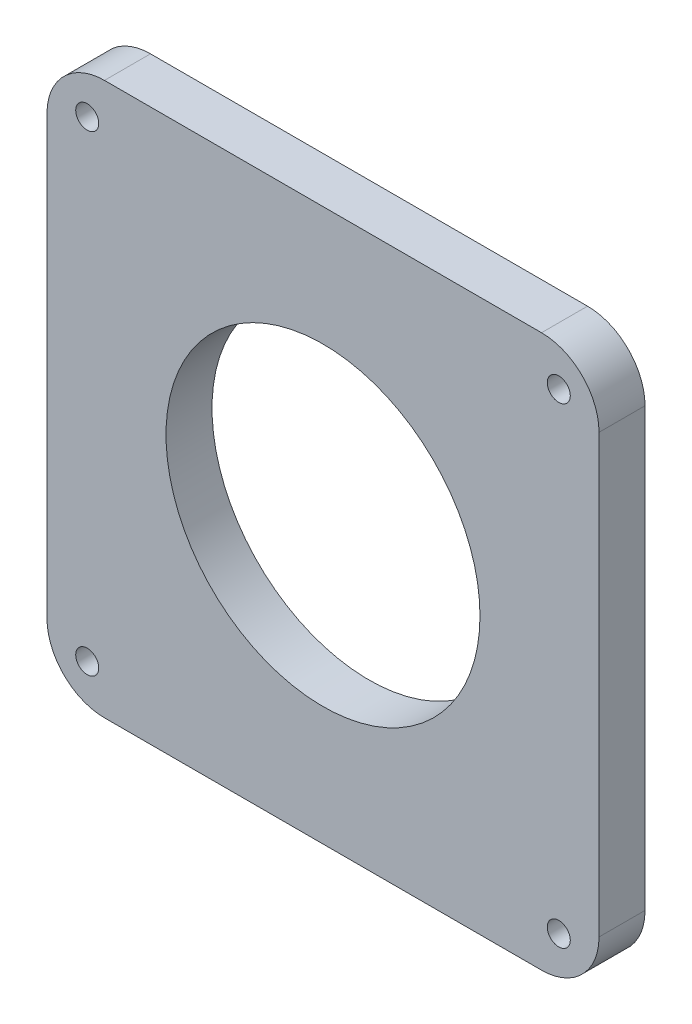
ISO-10303-21;
HEADER;
FILE_DESCRIPTION(('STEP AP214'),'2;1');
FILE_NAME('part.step','',(''),(''),'','','');
FILE_SCHEMA(('AUTOMOTIVE_DESIGN { 1 0 10303 214 1 1 1 1 }'));
ENDSEC;
DATA;
#1=APPLICATION_CONTEXT('core data for automotive mechanical design processes');
#2=APPLICATION_PROTOCOL_DEFINITION('international standard','automotive_design',2000,#1);
#3=PRODUCT_CONTEXT('',#1,'mechanical');
#4=PRODUCT('Part','Part','',(#3));
#5=PRODUCT_RELATED_PRODUCT_CATEGORY('part','',(#4));
#6=PRODUCT_DEFINITION_FORMATION('','',#4);
#7=PRODUCT_DEFINITION_CONTEXT('part definition',#1,'design');
#8=PRODUCT_DEFINITION('design','',#6,#7);
#9=PRODUCT_DEFINITION_SHAPE('','',#8);
#10=(LENGTH_UNIT() NAMED_UNIT(*) SI_UNIT(.MILLI.,.METRE.));
#11=(NAMED_UNIT(*) PLANE_ANGLE_UNIT() SI_UNIT($,.RADIAN.));
#12=(NAMED_UNIT(*) SI_UNIT($,.STERADIAN.) SOLID_ANGLE_UNIT());
#13=UNCERTAINTY_MEASURE_WITH_UNIT(LENGTH_MEASURE(1.E-05),#10,'distance_accuracy_value','');
#14=(GEOMETRIC_REPRESENTATION_CONTEXT(3) GLOBAL_UNCERTAINTY_ASSIGNED_CONTEXT((#13)) GLOBAL_UNIT_ASSIGNED_CONTEXT((#10,
#11,#12)) REPRESENTATION_CONTEXT('',''));
#15=CARTESIAN_POINT('',(0.,0.,0.));
#16=DIRECTION('',(0.,0.,1.));
#17=DIRECTION('',(1.,0.,0.));
#18=AXIS2_PLACEMENT_3D('',#15,#16,#17);
#19=CARTESIAN_POINT('',(10.,86.,8.));
#20=DIRECTION('',(0.,0.,1.));
#21=DIRECTION('',(1.,0.,0.));
#22=AXIS2_PLACEMENT_3D('',#19,#20,#21);
#23=PLANE('',#22);
#24=CARTESIAN_POINT('',(6.99999999999999,7.00000000000001,8.));
#25=DIRECTION('',(0.,0.,-1.));
#26=DIRECTION('',(-1.,0.,0.));
#27=AXIS2_PLACEMENT_3D('',#24,#25,#26);
#28=CIRCLE('',#27,2.);
#29=CARTESIAN_POINT('',(4.99999999999999,7.00000000000001,8.));
#30=VERTEX_POINT('',#29);
#31=EDGE_CURVE('E459',#30,#30,#28,.T.);
#32=ORIENTED_EDGE('',*,*,#31,.T.);
#33=EDGE_LOOP('',(#32));
#34=FACE_BOUND('',#33,.T.);
#35=CARTESIAN_POINT('',(89.,7.00000000000001,8.));
#36=DIRECTION('',(0.,0.,-1.));
#37=DIRECTION('',(-1.,0.,0.));
#38=AXIS2_PLACEMENT_3D('',#35,#36,#37);
#39=CIRCLE('',#38,2.);
#40=CARTESIAN_POINT('',(87.,7.00000000000001,8.));
#41=VERTEX_POINT('',#40);
#42=EDGE_CURVE('E455',#41,#41,#39,.T.);
#43=ORIENTED_EDGE('',*,*,#42,.T.);
#44=EDGE_LOOP('',(#43));
#45=FACE_BOUND('',#44,.T.);
#46=CARTESIAN_POINT('',(89.,89.,8.));
#47=DIRECTION('',(0.,0.,-1.));
#48=DIRECTION('',(-1.,0.,0.));
#49=AXIS2_PLACEMENT_3D('',#46,#47,#48);
#50=CIRCLE('',#49,2.);
#51=CARTESIAN_POINT('',(87.,89.,8.));
#52=VERTEX_POINT('',#51);
#53=EDGE_CURVE('E453',#52,#52,#50,.T.);
#54=ORIENTED_EDGE('',*,*,#53,.T.);
#55=EDGE_LOOP('',(#54));
#56=FACE_BOUND('',#55,.T.);
#57=CARTESIAN_POINT('',(6.99999999999999,89.,8.));
#58=DIRECTION('',(0.,0.,-1.));
#59=DIRECTION('',(-1.,0.,0.));
#60=AXIS2_PLACEMENT_3D('',#57,#58,#59);
#61=CIRCLE('',#60,2.);
#62=CARTESIAN_POINT('',(4.99999999999999,89.,8.));
#63=VERTEX_POINT('',#62);
#64=EDGE_CURVE('E135',#63,#63,#61,.T.);
#65=ORIENTED_EDGE('',*,*,#64,.T.);
#66=EDGE_LOOP('',(#65));
#67=FACE_BOUND('',#66,.T.);
#68=CARTESIAN_POINT('',(10.,86.,8.));
#69=DIRECTION('',(0.,0.,1.));
#70=DIRECTION('',(1.,0.,0.));
#71=AXIS2_PLACEMENT_3D('',#68,#69,#70);
#72=CIRCLE('',#71,10.);
#73=CARTESIAN_POINT('',(10.0000000000001,96.,8.));
#74=VERTEX_POINT('',#73);
#75=CARTESIAN_POINT('',(0.,85.9999999999999,8.));
#76=VERTEX_POINT('',#75);
#77=EDGE_CURVE('E112',#74,#76,#72,.T.);
#78=ORIENTED_EDGE('',*,*,#77,.T.);
#79=DIRECTION('',(0.,-1.,0.));
#80=VECTOR('',#79,1.);
#81=CARTESIAN_POINT('',(0.,85.9999999999999,8.));
#82=LINE('',#81,#80);
#83=CARTESIAN_POINT('',(0.,10.0000000000001,8.));
#84=VERTEX_POINT('',#83);
#85=EDGE_CURVE('E120',#76,#84,#82,.T.);
#86=ORIENTED_EDGE('',*,*,#85,.T.);
#87=CARTESIAN_POINT('',(10.,10.,8.));
#88=DIRECTION('',(0.,0.,1.));
#89=DIRECTION('',(1.,0.,0.));
#90=AXIS2_PLACEMENT_3D('',#87,#88,#89);
#91=CIRCLE('',#90,10.);
#92=CARTESIAN_POINT('',(10.0000000000001,0.,8.));
#93=VERTEX_POINT('',#92);
#94=EDGE_CURVE('E125',#84,#93,#91,.T.);
#95=ORIENTED_EDGE('',*,*,#94,.T.);
#96=DIRECTION('',(1.,0.,0.));
#97=VECTOR('',#96,1.);
#98=CARTESIAN_POINT('',(10.0000000000001,0.,8.));
#99=LINE('',#98,#97);
#100=CARTESIAN_POINT('',(85.9999999999999,0.,8.));
#101=VERTEX_POINT('',#100);
#102=EDGE_CURVE('E140',#93,#101,#99,.T.);
#103=ORIENTED_EDGE('',*,*,#102,.T.);
#104=CARTESIAN_POINT('',(86.,10.,8.));
#105=DIRECTION('',(0.,0.,1.));
#106=DIRECTION('',(1.,0.,0.));
#107=AXIS2_PLACEMENT_3D('',#104,#105,#106);
#108=CIRCLE('',#107,10.);
#109=CARTESIAN_POINT('',(96.,10.,8.));
#110=VERTEX_POINT('',#109);
#111=EDGE_CURVE('E143',#101,#110,#108,.T.);
#112=ORIENTED_EDGE('',*,*,#111,.T.);
#113=DIRECTION('',(0.,1.,0.));
#114=VECTOR('',#113,1.);
#115=CARTESIAN_POINT('',(96.,10.,8.));
#116=LINE('',#115,#114);
#117=CARTESIAN_POINT('',(96.,85.9999999999999,8.));
#118=VERTEX_POINT('',#117);
#119=EDGE_CURVE('E146',#110,#118,#116,.T.);
#120=ORIENTED_EDGE('',*,*,#119,.T.);
#121=CARTESIAN_POINT('',(86.,86.,8.));
#122=DIRECTION('',(0.,0.,1.));
#123=DIRECTION('',(1.,0.,0.));
#124=AXIS2_PLACEMENT_3D('',#121,#122,#123);
#125=CIRCLE('',#124,9.99999999999999);
#126=CARTESIAN_POINT('',(85.9999999999999,96.,8.));
#127=VERTEX_POINT('',#126);
#128=EDGE_CURVE('E149',#118,#127,#125,.T.);
#129=ORIENTED_EDGE('',*,*,#128,.T.);
#130=DIRECTION('',(-1.,0.,0.));
#131=VECTOR('',#130,1.);
#132=CARTESIAN_POINT('',(85.9999999999999,96.,8.));
#133=LINE('',#132,#131);
#134=EDGE_CURVE('E131',#127,#74,#133,.T.);
#135=ORIENTED_EDGE('',*,*,#134,.T.);
#136=EDGE_LOOP('',(#78,#86,#95,#103,#112,#120,#129,#135));
#137=FACE_BOUND('',#136,.T.);
#138=CARTESIAN_POINT('',(48.,48.,8.));
#139=DIRECTION('',(0.,0.,1.));
#140=DIRECTION('',(1.,0.,0.));
#141=AXIS2_PLACEMENT_3D('',#138,#139,#140);
#142=CIRCLE('',#141,27.3);
#143=CARTESIAN_POINT('',(75.3,48.,8.));
#144=VERTEX_POINT('',#143);
#145=EDGE_CURVE('E132',#144,#144,#142,.T.);
#146=ORIENTED_EDGE('',*,*,#145,.F.);
#147=EDGE_LOOP('',(#146));
#148=FACE_BOUND('',#147,.T.);
#149=ADVANCED_FACE('F41',(#34,#45,#56,#67,#137,#148),#23,.T.);
#150=CARTESIAN_POINT('',(0.,96.,0.6));
#151=DIRECTION('',(1.,0.,0.));
#152=DIRECTION('',(0.,1.,0.));
#153=AXIS2_PLACEMENT_3D('',#150,#151,#152);
#154=PLANE('',#153);
#155=DIRECTION('',(0.,0.,1.));
#156=VECTOR('',#155,1.);
#157=CARTESIAN_POINT('',(0.,10.0000000000001,-74.));
#158=LINE('',#157,#156);
#159=CARTESIAN_POINT('',(0.,10.0000000000001,0.));
#160=VERTEX_POINT('',#159);
#161=EDGE_CURVE('E121',#160,#84,#158,.T.);
#162=ORIENTED_EDGE('',*,*,#161,.T.);
#163=ORIENTED_EDGE('',*,*,#85,.F.);
#164=DIRECTION('',(0.,0.,1.));
#165=VECTOR('',#164,1.);
#166=CARTESIAN_POINT('',(0.,85.9999999999999,-74.));
#167=LINE('',#166,#165);
#168=CARTESIAN_POINT('',(0.,85.9999999999999,0.));
#169=VERTEX_POINT('',#168);
#170=EDGE_CURVE('E108',#169,#76,#167,.T.);
#171=ORIENTED_EDGE('',*,*,#170,.F.);
#172=DIRECTION('',(0.,-1.,0.));
#173=VECTOR('',#172,1.);
#174=CARTESIAN_POINT('',(0.,96.,0.));
#175=LINE('',#174,#173);
#176=EDGE_CURVE('E183',#169,#160,#175,.T.);
#177=ORIENTED_EDGE('',*,*,#176,.T.);
#178=EDGE_LOOP('',(#162,#163,#171,#177));
#179=FACE_BOUND('',#178,.T.);
#180=ADVANCED_FACE('F43',(#179),#154,.F.);
#181=CARTESIAN_POINT('',(0.,0.,0.6));
#182=DIRECTION('',(0.,1.,0.));
#183=DIRECTION('',(0.,0.,1.));
#184=AXIS2_PLACEMENT_3D('',#181,#182,#183);
#185=PLANE('',#184);
#186=DIRECTION('',(0.,0.,1.));
#187=VECTOR('',#186,1.);
#188=CARTESIAN_POINT('',(85.9999999999999,0.,-74.));
#189=LINE('',#188,#187);
#190=CARTESIAN_POINT('',(85.9999999999999,0.,0.));
#191=VERTEX_POINT('',#190);
#192=EDGE_CURVE('E58',#191,#101,#189,.T.);
#193=ORIENTED_EDGE('',*,*,#192,.T.);
#194=ORIENTED_EDGE('',*,*,#102,.F.);
#195=DIRECTION('',(0.,0.,1.));
#196=VECTOR('',#195,1.);
#197=CARTESIAN_POINT('',(10.0000000000001,0.,-74.));
#198=LINE('',#197,#196);
#199=CARTESIAN_POINT('',(10.0000000000001,0.,0.));
#200=VERTEX_POINT('',#199);
#201=EDGE_CURVE('E180',#200,#93,#198,.T.);
#202=ORIENTED_EDGE('',*,*,#201,.F.);
#203=DIRECTION('',(1.,0.,0.));
#204=VECTOR('',#203,1.);
#205=CARTESIAN_POINT('',(0.,0.,0.));
#206=LINE('',#205,#204);
#207=EDGE_CURVE('E188',#200,#191,#206,.T.);
#208=ORIENTED_EDGE('',*,*,#207,.T.);
#209=EDGE_LOOP('',(#193,#194,#202,#208));
#210=FACE_BOUND('',#209,.T.);
#211=ADVANCED_FACE('F221',(#210),#185,.F.);
#212=CARTESIAN_POINT('',(96.,0.,0.6));
#213=DIRECTION('',(-1.,0.,0.));
#214=DIRECTION('',(0.,0.,1.));
#215=AXIS2_PLACEMENT_3D('',#212,#213,#214);
#216=PLANE('',#215);
#217=DIRECTION('',(0.,0.,1.));
#218=VECTOR('',#217,1.);
#219=CARTESIAN_POINT('',(96.,85.9999999999999,-74.));
#220=LINE('',#219,#218);
#221=CARTESIAN_POINT('',(96.,85.9999999999999,0.));
#222=VERTEX_POINT('',#221);
#223=EDGE_CURVE('E66',#222,#118,#220,.T.);
#224=ORIENTED_EDGE('',*,*,#223,.T.);
#225=ORIENTED_EDGE('',*,*,#119,.F.);
#226=DIRECTION('',(0.,0.,1.));
#227=VECTOR('',#226,1.);
#228=CARTESIAN_POINT('',(96.,10.0000000000001,-74.));
#229=LINE('',#228,#227);
#230=CARTESIAN_POINT('',(96.,10.0000000000001,0.));
#231=VERTEX_POINT('',#230);
#232=EDGE_CURVE('E170',#231,#110,#229,.T.);
#233=ORIENTED_EDGE('',*,*,#232,.F.);
#234=DIRECTION('',(0.,1.,0.));
#235=VECTOR('',#234,1.);
#236=CARTESIAN_POINT('',(96.,0.,0.));
#237=LINE('',#236,#235);
#238=EDGE_CURVE('E192',#231,#222,#237,.T.);
#239=ORIENTED_EDGE('',*,*,#238,.T.);
#240=EDGE_LOOP('',(#224,#225,#233,#239));
#241=FACE_BOUND('',#240,.T.);
#242=ADVANCED_FACE('F215',(#241),#216,.F.);
#243=CARTESIAN_POINT('',(96.,96.,0.6));
#244=DIRECTION('',(0.,-1.,0.));
#245=DIRECTION('',(1.,0.,0.));
#246=AXIS2_PLACEMENT_3D('',#243,#244,#245);
#247=PLANE('',#246);
#248=DIRECTION('',(0.,0.,1.));
#249=VECTOR('',#248,1.);
#250=CARTESIAN_POINT('',(10.0000000000001,96.,-74.));
#251=LINE('',#250,#249);
#252=CARTESIAN_POINT('',(10.0000000000001,96.,0.));
#253=VERTEX_POINT('',#252);
#254=EDGE_CURVE('E117',#253,#74,#251,.T.);
#255=ORIENTED_EDGE('',*,*,#254,.T.);
#256=ORIENTED_EDGE('',*,*,#134,.F.);
#257=DIRECTION('',(0.,0.,1.));
#258=VECTOR('',#257,1.);
#259=CARTESIAN_POINT('',(85.9999999999999,96.,-74.));
#260=LINE('',#259,#258);
#261=CARTESIAN_POINT('',(85.9999999999999,96.,0.));
#262=VERTEX_POINT('',#261);
#263=EDGE_CURVE('E175',#262,#127,#260,.T.);
#264=ORIENTED_EDGE('',*,*,#263,.F.);
#265=DIRECTION('',(-1.,0.,0.));
#266=VECTOR('',#265,1.);
#267=CARTESIAN_POINT('',(96.,96.,0.));
#268=LINE('',#267,#266);
#269=EDGE_CURVE('E196',#262,#253,#268,.T.);
#270=ORIENTED_EDGE('',*,*,#269,.T.);
#271=EDGE_LOOP('',(#255,#256,#264,#270));
#272=FACE_BOUND('',#271,.T.);
#273=ADVANCED_FACE('F233',(#272),#247,.F.);
#274=CARTESIAN_POINT('',(0.,0.,0.));
#275=DIRECTION('',(0.,0.,1.));
#276=DIRECTION('',(1.,0.,0.));
#277=AXIS2_PLACEMENT_3D('',#274,#275,#276);
#278=PLANE('',#277);
#279=CARTESIAN_POINT('',(89.,7.00000000000001,0.));
#280=DIRECTION('',(0.,0.,-1.));
#281=DIRECTION('',(-1.,0.,0.));
#282=AXIS2_PLACEMENT_3D('',#279,#280,#281);
#283=CIRCLE('',#282,2.);
#284=CARTESIAN_POINT('',(87.,7.00000000000001,0.));
#285=VERTEX_POINT('',#284);
#286=EDGE_CURVE('E152',#285,#285,#283,.T.);
#287=ORIENTED_EDGE('',*,*,#286,.F.);
#288=EDGE_LOOP('',(#287));
#289=FACE_BOUND('',#288,.T.);
#290=CARTESIAN_POINT('',(6.99999999999999,7.00000000000001,0.));
#291=DIRECTION('',(0.,0.,-1.));
#292=DIRECTION('',(-1.,0.,0.));
#293=AXIS2_PLACEMENT_3D('',#290,#291,#292);
#294=CIRCLE('',#293,2.);
#295=CARTESIAN_POINT('',(4.99999999999999,7.00000000000001,0.));
#296=VERTEX_POINT('',#295);
#297=EDGE_CURVE('E158',#296,#296,#294,.T.);
#298=ORIENTED_EDGE('',*,*,#297,.F.);
#299=EDGE_LOOP('',(#298));
#300=FACE_BOUND('',#299,.T.);
#301=CARTESIAN_POINT('',(6.99999999999999,89.,0.));
#302=DIRECTION('',(0.,0.,-1.));
#303=DIRECTION('',(-1.,0.,0.));
#304=AXIS2_PLACEMENT_3D('',#301,#302,#303);
#305=CIRCLE('',#304,2.);
#306=CARTESIAN_POINT('',(4.99999999999999,89.,0.));
#307=VERTEX_POINT('',#306);
#308=EDGE_CURVE('E153',#307,#307,#305,.T.);
#309=ORIENTED_EDGE('',*,*,#308,.F.);
#310=EDGE_LOOP('',(#309));
#311=FACE_BOUND('',#310,.T.);
#312=CARTESIAN_POINT('',(89.,89.,0.));
#313=DIRECTION('',(0.,0.,-1.));
#314=DIRECTION('',(-1.,0.,0.));
#315=AXIS2_PLACEMENT_3D('',#312,#313,#314);
#316=CIRCLE('',#315,2.);
#317=CARTESIAN_POINT('',(87.,89.,0.));
#318=VERTEX_POINT('',#317);
#319=EDGE_CURVE('E157',#318,#318,#316,.T.);
#320=ORIENTED_EDGE('',*,*,#319,.F.);
#321=EDGE_LOOP('',(#320));
#322=FACE_BOUND('',#321,.T.);
#323=CARTESIAN_POINT('',(48.,48.,0.));
#324=DIRECTION('',(0.,0.,1.));
#325=DIRECTION('',(1.,0.,0.));
#326=AXIS2_PLACEMENT_3D('',#323,#324,#325);
#327=CIRCLE('',#326,27.3);
#328=CARTESIAN_POINT('',(75.3,48.,0.));
#329=VERTEX_POINT('',#328);
#330=EDGE_CURVE('E45',#329,#329,#327,.T.);
#331=ORIENTED_EDGE('',*,*,#330,.T.);
#332=EDGE_LOOP('',(#331));
#333=FACE_BOUND('',#332,.T.);
#334=ORIENTED_EDGE('',*,*,#176,.F.);
#335=CARTESIAN_POINT('',(10.,86.,0.));
#336=DIRECTION('',(0.,0.,1.));
#337=DIRECTION('',(1.,0.,0.));
#338=AXIS2_PLACEMENT_3D('',#335,#336,#337);
#339=CIRCLE('',#338,10.);
#340=EDGE_CURVE('E11',#169,#253,#339,.F.);
#341=ORIENTED_EDGE('',*,*,#340,.T.);
#342=ORIENTED_EDGE('',*,*,#269,.F.);
#343=CARTESIAN_POINT('',(86.,86.,0.));
#344=DIRECTION('',(0.,0.,1.));
#345=DIRECTION('',(1.,0.,0.));
#346=AXIS2_PLACEMENT_3D('',#343,#344,#345);
#347=CIRCLE('',#346,9.99999999999999);
#348=EDGE_CURVE('E51',#262,#222,#347,.F.);
#349=ORIENTED_EDGE('',*,*,#348,.T.);
#350=ORIENTED_EDGE('',*,*,#238,.F.);
#351=CARTESIAN_POINT('',(86.,10.,0.));
#352=DIRECTION('',(0.,0.,1.));
#353=DIRECTION('',(1.,0.,0.));
#354=AXIS2_PLACEMENT_3D('',#351,#352,#353);
#355=CIRCLE('',#354,10.);
#356=EDGE_CURVE('E204',#231,#191,#355,.F.);
#357=ORIENTED_EDGE('',*,*,#356,.T.);
#358=ORIENTED_EDGE('',*,*,#207,.F.);
#359=CARTESIAN_POINT('',(10.,10.,0.));
#360=DIRECTION('',(0.,0.,1.));
#361=DIRECTION('',(1.,0.,0.));
#362=AXIS2_PLACEMENT_3D('',#359,#360,#361);
#363=CIRCLE('',#362,10.);
#364=EDGE_CURVE('E200',#200,#160,#363,.F.);
#365=ORIENTED_EDGE('',*,*,#364,.T.);
#366=EDGE_LOOP('',(#334,#341,#342,#349,#350,#357,#358,#365));
#367=FACE_BOUND('',#366,.T.);
#368=ADVANCED_FACE('F211',(#289,#300,#311,#322,#333,#367),#278,.F.);
#369=CARTESIAN_POINT('',(10.,10.,-74.));
#370=DIRECTION('',(0.,0.,1.));
#371=DIRECTION('',(1.,0.,0.));
#372=AXIS2_PLACEMENT_3D('',#369,#370,#371);
#373=CYLINDRICAL_SURFACE('',#372,10.);
#374=ORIENTED_EDGE('',*,*,#201,.T.);
#375=ORIENTED_EDGE('',*,*,#94,.F.);
#376=ORIENTED_EDGE('',*,*,#161,.F.);
#377=ORIENTED_EDGE('',*,*,#364,.F.);
#378=EDGE_LOOP('',(#374,#375,#376,#377));
#379=FACE_BOUND('',#378,.T.);
#380=ADVANCED_FACE('F224',(#379),#373,.T.);
#381=CARTESIAN_POINT('',(86.,10.,-74.));
#382=DIRECTION('',(0.,0.,1.));
#383=DIRECTION('',(1.,0.,0.));
#384=AXIS2_PLACEMENT_3D('',#381,#382,#383);
#385=CYLINDRICAL_SURFACE('',#384,10.);
#386=ORIENTED_EDGE('',*,*,#232,.T.);
#387=ORIENTED_EDGE('',*,*,#111,.F.);
#388=ORIENTED_EDGE('',*,*,#192,.F.);
#389=ORIENTED_EDGE('',*,*,#356,.F.);
#390=EDGE_LOOP('',(#386,#387,#388,#389));
#391=FACE_BOUND('',#390,.T.);
#392=ADVANCED_FACE('F217',(#391),#385,.T.);
#393=CARTESIAN_POINT('',(86.,86.,-74.));
#394=DIRECTION('',(0.,0.,1.));
#395=DIRECTION('',(1.,0.,0.));
#396=AXIS2_PLACEMENT_3D('',#393,#394,#395);
#397=CYLINDRICAL_SURFACE('',#396,9.99999999999999);
#398=ORIENTED_EDGE('',*,*,#263,.T.);
#399=ORIENTED_EDGE('',*,*,#128,.F.);
#400=ORIENTED_EDGE('',*,*,#223,.F.);
#401=ORIENTED_EDGE('',*,*,#348,.F.);
#402=EDGE_LOOP('',(#398,#399,#400,#401));
#403=FACE_BOUND('',#402,.T.);
#404=ADVANCED_FACE('F231',(#403),#397,.T.);
#405=CARTESIAN_POINT('',(10.,86.,-74.));
#406=DIRECTION('',(0.,0.,1.));
#407=DIRECTION('',(1.,0.,0.));
#408=AXIS2_PLACEMENT_3D('',#405,#406,#407);
#409=CYLINDRICAL_SURFACE('',#408,10.);
#410=ORIENTED_EDGE('',*,*,#170,.T.);
#411=ORIENTED_EDGE('',*,*,#77,.F.);
#412=ORIENTED_EDGE('',*,*,#254,.F.);
#413=ORIENTED_EDGE('',*,*,#340,.F.);
#414=EDGE_LOOP('',(#410,#411,#412,#413));
#415=FACE_BOUND('',#414,.T.);
#416=ADVANCED_FACE('F110',(#415),#409,.T.);
#417=CARTESIAN_POINT('',(48.,48.,-74.));
#418=DIRECTION('',(0.,0.,1.));
#419=DIRECTION('',(1.,0.,0.));
#420=AXIS2_PLACEMENT_3D('',#417,#418,#419);
#421=CYLINDRICAL_SURFACE('',#420,27.3);
#422=ORIENTED_EDGE('',*,*,#330,.F.);
#423=EDGE_LOOP('',(#422));
#424=FACE_BOUND('',#423,.T.);
#425=ORIENTED_EDGE('',*,*,#145,.T.);
#426=EDGE_LOOP('',(#425));
#427=FACE_BOUND('',#426,.T.);
#428=ADVANCED_FACE('F261',(#424,#427),#421,.F.);
#429=CARTESIAN_POINT('',(89.,89.,74.6));
#430=DIRECTION('',(0.,0.,-1.));
#431=DIRECTION('',(-1.,0.,0.));
#432=AXIS2_PLACEMENT_3D('',#429,#430,#431);
#433=CYLINDRICAL_SURFACE('',#432,2.);
#434=ORIENTED_EDGE('',*,*,#319,.T.);
#435=EDGE_LOOP('',(#434));
#436=FACE_BOUND('',#435,.T.);
#437=ORIENTED_EDGE('',*,*,#53,.F.);
#438=EDGE_LOOP('',(#437));
#439=FACE_BOUND('',#438,.T.);
#440=ADVANCED_FACE('F250',(#436,#439),#433,.F.);
#441=CARTESIAN_POINT('',(6.99999999999999,89.,74.6));
#442=DIRECTION('',(0.,0.,-1.));
#443=DIRECTION('',(-1.,0.,0.));
#444=AXIS2_PLACEMENT_3D('',#441,#442,#443);
#445=CYLINDRICAL_SURFACE('',#444,2.);
#446=ORIENTED_EDGE('',*,*,#308,.T.);
#447=EDGE_LOOP('',(#446));
#448=FACE_BOUND('',#447,.T.);
#449=ORIENTED_EDGE('',*,*,#64,.F.);
#450=EDGE_LOOP('',(#449));
#451=FACE_BOUND('',#450,.T.);
#452=ADVANCED_FACE('F246',(#448,#451),#445,.F.);
#453=CARTESIAN_POINT('',(6.99999999999999,7.00000000000001,74.6));
#454=DIRECTION('',(0.,0.,-1.));
#455=DIRECTION('',(-1.,0.,0.));
#456=AXIS2_PLACEMENT_3D('',#453,#454,#455);
#457=CYLINDRICAL_SURFACE('',#456,2.);
#458=ORIENTED_EDGE('',*,*,#297,.T.);
#459=EDGE_LOOP('',(#458));
#460=FACE_BOUND('',#459,.T.);
#461=ORIENTED_EDGE('',*,*,#31,.F.);
#462=EDGE_LOOP('',(#461));
#463=FACE_BOUND('',#462,.T.);
#464=ADVANCED_FACE('F249',(#460,#463),#457,.F.);
#465=CARTESIAN_POINT('',(89.,7.00000000000001,74.6));
#466=DIRECTION('',(0.,0.,-1.));
#467=DIRECTION('',(-1.,0.,0.));
#468=AXIS2_PLACEMENT_3D('',#465,#466,#467);
#469=CYLINDRICAL_SURFACE('',#468,2.);
#470=ORIENTED_EDGE('',*,*,#286,.T.);
#471=EDGE_LOOP('',(#470));
#472=FACE_BOUND('',#471,.T.);
#473=ORIENTED_EDGE('',*,*,#42,.F.);
#474=EDGE_LOOP('',(#473));
#475=FACE_BOUND('',#474,.T.);
#476=ADVANCED_FACE('F254',(#472,#475),#469,.F.);
#477=CLOSED_SHELL('',(#149,#180,#211,#242,#273,#368,#380,#392,#404,#416,#428,#440,#452,#464,#476));
#478=MANIFOLD_SOLID_BREP('B2',#477);
#479=ADVANCED_BREP_SHAPE_REPRESENTATION('',(#18,#478),#14);
#480=SHAPE_DEFINITION_REPRESENTATION(#9,#479);
ENDSEC;
END-ISO-10303-21;
